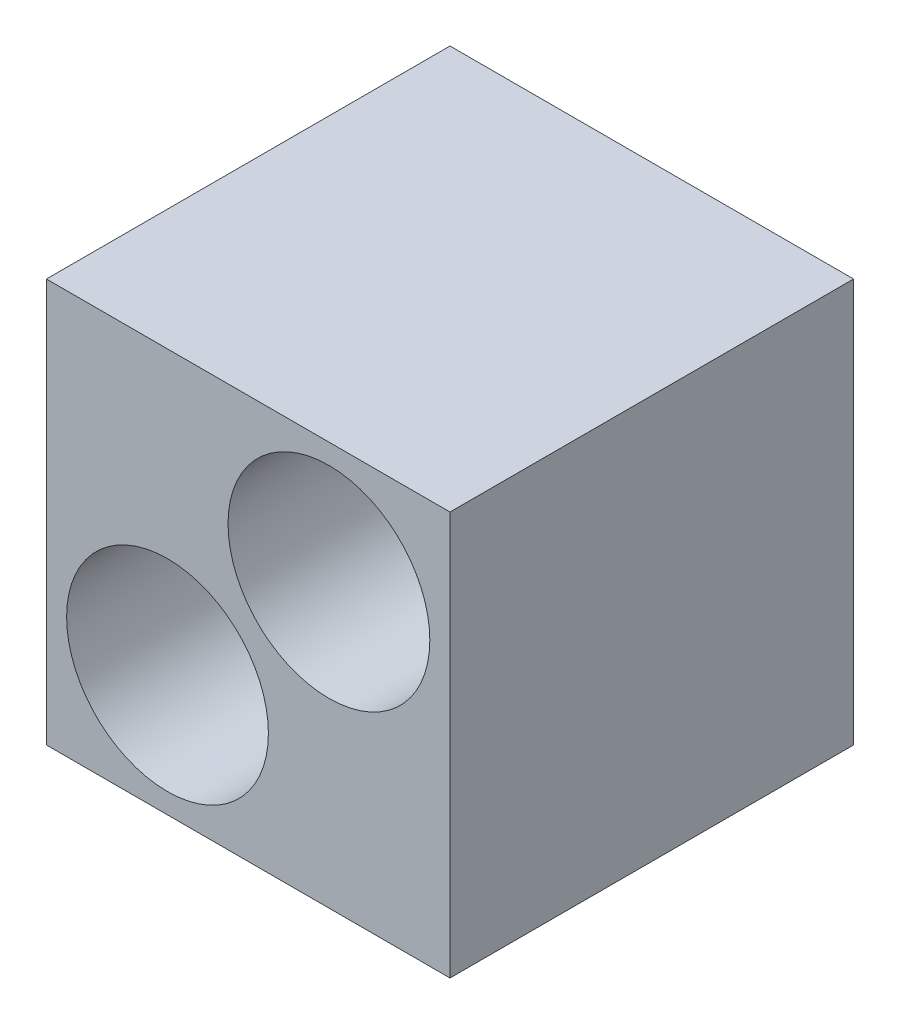
ISO-10303-21;
HEADER;
FILE_DESCRIPTION(('STEP AP214'),'2;1');
FILE_NAME('part.step','',(''),(''),'','','');
FILE_SCHEMA(('AUTOMOTIVE_DESIGN { 1 0 10303 214 1 1 1 1 }'));
ENDSEC;
DATA;
#1=APPLICATION_CONTEXT('core data for automotive mechanical design processes');
#2=APPLICATION_PROTOCOL_DEFINITION('international standard','automotive_design',2000,#1);
#3=PRODUCT_CONTEXT('',#1,'mechanical');
#4=PRODUCT('Part','Part','',(#3));
#5=PRODUCT_RELATED_PRODUCT_CATEGORY('part','',(#4));
#6=PRODUCT_DEFINITION_FORMATION('','',#4);
#7=PRODUCT_DEFINITION_CONTEXT('part definition',#1,'design');
#8=PRODUCT_DEFINITION('design','',#6,#7);
#9=PRODUCT_DEFINITION_SHAPE('','',#8);
#10=(LENGTH_UNIT() NAMED_UNIT(*) SI_UNIT(.MILLI.,.METRE.));
#11=(NAMED_UNIT(*) PLANE_ANGLE_UNIT() SI_UNIT($,.RADIAN.));
#12=(NAMED_UNIT(*) SI_UNIT($,.STERADIAN.) SOLID_ANGLE_UNIT());
#13=UNCERTAINTY_MEASURE_WITH_UNIT(LENGTH_MEASURE(1.E-05),#10,'distance_accuracy_value','');
#14=(GEOMETRIC_REPRESENTATION_CONTEXT(3) GLOBAL_UNCERTAINTY_ASSIGNED_CONTEXT((#13)) GLOBAL_UNIT_ASSIGNED_CONTEXT((#10,
#11,#12)) REPRESENTATION_CONTEXT('',''));
#15=CARTESIAN_POINT('',(0.,0.,0.));
#16=DIRECTION('',(0.,0.,1.));
#17=DIRECTION('',(1.,0.,0.));
#18=AXIS2_PLACEMENT_3D('',#15,#16,#17);
#19=CARTESIAN_POINT('',(0.,0.,10.));
#20=DIRECTION('',(1.,0.,0.));
#21=DIRECTION('',(0.,0.,-1.));
#22=AXIS2_PLACEMENT_3D('',#19,#20,#21);
#23=PLANE('',#22);
#24=DIRECTION('',(0.,-1.,0.));
#25=VECTOR('',#24,1.);
#26=CARTESIAN_POINT('',(0.,0.,0.));
#27=LINE('',#26,#25);
#28=CARTESIAN_POINT('',(0.,10.,0.));
#29=VERTEX_POINT('',#28);
#30=CARTESIAN_POINT('',(0.,0.,0.));
#31=VERTEX_POINT('',#30);
#32=EDGE_CURVE('E98',#29,#31,#27,.T.);
#33=ORIENTED_EDGE('',*,*,#32,.T.);
#34=DIRECTION('',(0.,0.,-1.));
#35=VECTOR('',#34,1.);
#36=CARTESIAN_POINT('',(0.,0.,10.));
#37=LINE('',#36,#35);
#38=CARTESIAN_POINT('',(0.,0.,10.));
#39=VERTEX_POINT('',#38);
#40=EDGE_CURVE('E11',#39,#31,#37,.T.);
#41=ORIENTED_EDGE('',*,*,#40,.F.);
#42=DIRECTION('',(0.,-1.,0.));
#43=VECTOR('',#42,1.);
#44=CARTESIAN_POINT('',(0.,0.,10.));
#45=LINE('',#44,#43);
#46=CARTESIAN_POINT('',(0.,10.,10.));
#47=VERTEX_POINT('',#46);
#48=EDGE_CURVE('E86',#47,#39,#45,.T.);
#49=ORIENTED_EDGE('',*,*,#48,.F.);
#50=DIRECTION('',(0.,0.,-1.));
#51=VECTOR('',#50,1.);
#52=CARTESIAN_POINT('',(0.,10.,10.));
#53=LINE('',#52,#51);
#54=EDGE_CURVE('E94',#47,#29,#53,.T.);
#55=ORIENTED_EDGE('',*,*,#54,.T.);
#56=EDGE_LOOP('',(#33,#41,#49,#55));
#57=FACE_BOUND('',#56,.T.);
#58=ADVANCED_FACE('F35',(#57),#23,.F.);
#59=CARTESIAN_POINT('',(0.,0.,10.));
#60=DIRECTION('',(0.,1.,0.));
#61=DIRECTION('',(0.,0.,1.));
#62=AXIS2_PLACEMENT_3D('',#59,#60,#61);
#63=PLANE('',#62);
#64=DIRECTION('',(1.,0.,0.));
#65=VECTOR('',#64,1.);
#66=CARTESIAN_POINT('',(0.,0.,0.));
#67=LINE('',#66,#65);
#68=CARTESIAN_POINT('',(10.,0.,0.));
#69=VERTEX_POINT('',#68);
#70=EDGE_CURVE('E90',#31,#69,#67,.T.);
#71=ORIENTED_EDGE('',*,*,#70,.T.);
#72=DIRECTION('',(0.,0.,-1.));
#73=VECTOR('',#72,1.);
#74=CARTESIAN_POINT('',(10.,0.,10.));
#75=LINE('',#74,#73);
#76=CARTESIAN_POINT('',(10.,0.,10.));
#77=VERTEX_POINT('',#76);
#78=EDGE_CURVE('E43',#77,#69,#75,.T.);
#79=ORIENTED_EDGE('',*,*,#78,.F.);
#80=DIRECTION('',(1.,0.,0.));
#81=VECTOR('',#80,1.);
#82=CARTESIAN_POINT('',(0.,0.,10.));
#83=LINE('',#82,#81);
#84=EDGE_CURVE('E81',#39,#77,#83,.T.);
#85=ORIENTED_EDGE('',*,*,#84,.F.);
#86=ORIENTED_EDGE('',*,*,#40,.T.);
#87=EDGE_LOOP('',(#71,#79,#85,#86));
#88=FACE_BOUND('',#87,.T.);
#89=ADVANCED_FACE('F89',(#88),#63,.F.);
#90=CARTESIAN_POINT('',(10.,0.,10.));
#91=DIRECTION('',(-1.,0.,0.));
#92=DIRECTION('',(0.,0.,1.));
#93=AXIS2_PLACEMENT_3D('',#90,#91,#92);
#94=PLANE('',#93);
#95=DIRECTION('',(0.,1.,0.));
#96=VECTOR('',#95,1.);
#97=CARTESIAN_POINT('',(10.,0.,0.));
#98=LINE('',#97,#96);
#99=CARTESIAN_POINT('',(10.,10.,0.));
#100=VERTEX_POINT('',#99);
#101=EDGE_CURVE('E68',#69,#100,#98,.T.);
#102=ORIENTED_EDGE('',*,*,#101,.T.);
#103=DIRECTION('',(0.,0.,-1.));
#104=VECTOR('',#103,1.);
#105=CARTESIAN_POINT('',(10.,10.,10.));
#106=LINE('',#105,#104);
#107=CARTESIAN_POINT('',(10.,10.,10.));
#108=VERTEX_POINT('',#107);
#109=EDGE_CURVE('E91',#108,#100,#106,.T.);
#110=ORIENTED_EDGE('',*,*,#109,.F.);
#111=DIRECTION('',(0.,1.,0.));
#112=VECTOR('',#111,1.);
#113=CARTESIAN_POINT('',(10.,0.,10.));
#114=LINE('',#113,#112);
#115=EDGE_CURVE('E84',#77,#108,#114,.T.);
#116=ORIENTED_EDGE('',*,*,#115,.F.);
#117=ORIENTED_EDGE('',*,*,#78,.T.);
#118=EDGE_LOOP('',(#102,#110,#116,#117));
#119=FACE_BOUND('',#118,.T.);
#120=ADVANCED_FACE('F92',(#119),#94,.F.);
#121=CARTESIAN_POINT('',(0.,10.,10.));
#122=DIRECTION('',(0.,-1.,0.));
#123=DIRECTION('',(0.,0.,-1.));
#124=AXIS2_PLACEMENT_3D('',#121,#122,#123);
#125=PLANE('',#124);
#126=DIRECTION('',(-1.,0.,0.));
#127=VECTOR('',#126,1.);
#128=CARTESIAN_POINT('',(0.,10.,0.));
#129=LINE('',#128,#127);
#130=EDGE_CURVE('E74',#100,#29,#129,.T.);
#131=ORIENTED_EDGE('',*,*,#130,.T.);
#132=ORIENTED_EDGE('',*,*,#54,.F.);
#133=DIRECTION('',(-1.,0.,0.));
#134=VECTOR('',#133,1.);
#135=CARTESIAN_POINT('',(0.,10.,10.));
#136=LINE('',#135,#134);
#137=EDGE_CURVE('E51',#108,#47,#136,.T.);
#138=ORIENTED_EDGE('',*,*,#137,.F.);
#139=ORIENTED_EDGE('',*,*,#109,.T.);
#140=EDGE_LOOP('',(#131,#132,#138,#139));
#141=FACE_BOUND('',#140,.T.);
#142=ADVANCED_FACE('F106',(#141),#125,.F.);
#143=CARTESIAN_POINT('',(0.,0.,10.));
#144=DIRECTION('',(0.,0.,-1.));
#145=DIRECTION('',(-1.,0.,0.));
#146=AXIS2_PLACEMENT_3D('',#143,#144,#145);
#147=PLANE('',#146);
#148=CARTESIAN_POINT('',(7.,7.,10.));
#149=DIRECTION('',(0.,0.,1.));
#150=DIRECTION('',(1.,0.,0.));
#151=AXIS2_PLACEMENT_3D('',#148,#149,#150);
#152=CIRCLE('',#151,2.5);
#153=CARTESIAN_POINT('',(9.5,7.,10.));
#154=VERTEX_POINT('',#153);
#155=EDGE_CURVE('E115',#154,#154,#152,.T.);
#156=ORIENTED_EDGE('',*,*,#155,.F.);
#157=EDGE_LOOP('',(#156));
#158=FACE_BOUND('',#157,.T.);
#159=CARTESIAN_POINT('',(3.,3.,10.));
#160=DIRECTION('',(0.,0.,1.));
#161=DIRECTION('',(1.,0.,0.));
#162=AXIS2_PLACEMENT_3D('',#159,#160,#161);
#163=CIRCLE('',#162,2.5);
#164=CARTESIAN_POINT('',(5.5,3.,10.));
#165=VERTEX_POINT('',#164);
#166=EDGE_CURVE('E101',#165,#165,#163,.T.);
#167=ORIENTED_EDGE('',*,*,#166,.F.);
#168=EDGE_LOOP('',(#167));
#169=FACE_BOUND('',#168,.T.);
#170=ORIENTED_EDGE('',*,*,#48,.T.);
#171=ORIENTED_EDGE('',*,*,#84,.T.);
#172=ORIENTED_EDGE('',*,*,#115,.T.);
#173=ORIENTED_EDGE('',*,*,#137,.T.);
#174=EDGE_LOOP('',(#170,#171,#172,#173));
#175=FACE_BOUND('',#174,.T.);
#176=ADVANCED_FACE('F82',(#158,#169,#175),#147,.F.);
#177=CARTESIAN_POINT('',(0.,0.,0.));
#178=DIRECTION('',(0.,0.,-1.));
#179=DIRECTION('',(-1.,0.,0.));
#180=AXIS2_PLACEMENT_3D('',#177,#178,#179);
#181=PLANE('',#180);
#182=CARTESIAN_POINT('',(7.,7.,0.));
#183=DIRECTION('',(0.,0.,1.));
#184=DIRECTION('',(1.,0.,0.));
#185=AXIS2_PLACEMENT_3D('',#182,#183,#184);
#186=CIRCLE('',#185,2.5);
#187=CARTESIAN_POINT('',(9.5,7.,0.));
#188=VERTEX_POINT('',#187);
#189=EDGE_CURVE('E118',#188,#188,#186,.T.);
#190=ORIENTED_EDGE('',*,*,#189,.T.);
#191=EDGE_LOOP('',(#190));
#192=FACE_BOUND('',#191,.T.);
#193=CARTESIAN_POINT('',(3.,3.,0.));
#194=DIRECTION('',(0.,0.,1.));
#195=DIRECTION('',(1.,0.,0.));
#196=AXIS2_PLACEMENT_3D('',#193,#194,#195);
#197=CIRCLE('',#196,2.5);
#198=CARTESIAN_POINT('',(5.5,3.,0.));
#199=VERTEX_POINT('',#198);
#200=EDGE_CURVE('E112',#199,#199,#197,.T.);
#201=ORIENTED_EDGE('',*,*,#200,.T.);
#202=EDGE_LOOP('',(#201));
#203=FACE_BOUND('',#202,.T.);
#204=ORIENTED_EDGE('',*,*,#32,.F.);
#205=ORIENTED_EDGE('',*,*,#130,.F.);
#206=ORIENTED_EDGE('',*,*,#101,.F.);
#207=ORIENTED_EDGE('',*,*,#70,.F.);
#208=EDGE_LOOP('',(#204,#205,#206,#207));
#209=FACE_BOUND('',#208,.T.);
#210=ADVANCED_FACE('F109',(#192,#203,#209),#181,.T.);
#211=CARTESIAN_POINT('',(3.,3.,10.));
#212=DIRECTION('',(0.,0.,-1.));
#213=DIRECTION('',(-1.,0.,0.));
#214=AXIS2_PLACEMENT_3D('',#211,#212,#213);
#215=CYLINDRICAL_SURFACE('',#214,2.5);
#216=ORIENTED_EDGE('',*,*,#166,.T.);
#217=EDGE_LOOP('',(#216));
#218=FACE_BOUND('',#217,.T.);
#219=ORIENTED_EDGE('',*,*,#200,.F.);
#220=EDGE_LOOP('',(#219));
#221=FACE_BOUND('',#220,.T.);
#222=ADVANCED_FACE('F132',(#218,#221),#215,.F.);
#223=CARTESIAN_POINT('',(7.,7.,10.));
#224=DIRECTION('',(0.,0.,-1.));
#225=DIRECTION('',(-1.,0.,0.));
#226=AXIS2_PLACEMENT_3D('',#223,#224,#225);
#227=CYLINDRICAL_SURFACE('',#226,2.5);
#228=ORIENTED_EDGE('',*,*,#155,.T.);
#229=EDGE_LOOP('',(#228));
#230=FACE_BOUND('',#229,.T.);
#231=ORIENTED_EDGE('',*,*,#189,.F.);
#232=EDGE_LOOP('',(#231));
#233=FACE_BOUND('',#232,.T.);
#234=ADVANCED_FACE('F124',(#230,#233),#227,.F.);
#235=CLOSED_SHELL('',(#58,#89,#120,#142,#176,#210,#222,#234));
#236=MANIFOLD_SOLID_BREP('B2',#235);
#237=ADVANCED_BREP_SHAPE_REPRESENTATION('',(#18,#236),#14);
#238=SHAPE_DEFINITION_REPRESENTATION(#9,#237);
ENDSEC;
END-ISO-10303-21;
